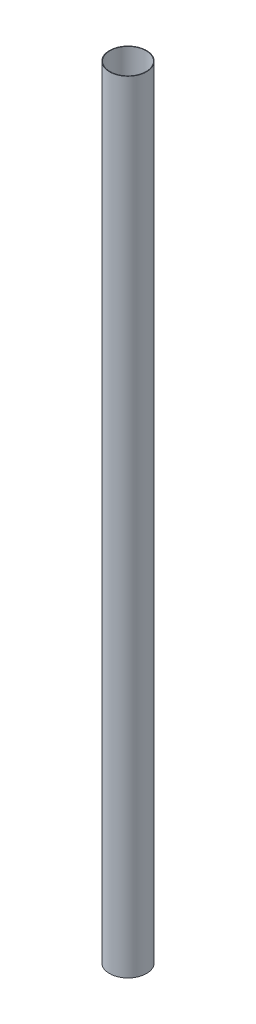
ISO-10303-21;
HEADER;
FILE_DESCRIPTION(('STEP AP214'),'2;1');
FILE_NAME('part.step','',(''),(''),'','','');
FILE_SCHEMA(('AUTOMOTIVE_DESIGN { 1 0 10303 214 1 1 1 1 }'));
ENDSEC;
DATA;
#1=APPLICATION_CONTEXT('core data for automotive mechanical design processes');
#2=APPLICATION_PROTOCOL_DEFINITION('international standard','automotive_design',2000,#1);
#3=PRODUCT_CONTEXT('',#1,'mechanical');
#4=PRODUCT('Part','Part','',(#3));
#5=PRODUCT_RELATED_PRODUCT_CATEGORY('part','',(#4));
#6=PRODUCT_DEFINITION_FORMATION('','',#4);
#7=PRODUCT_DEFINITION_CONTEXT('part definition',#1,'design');
#8=PRODUCT_DEFINITION('design','',#6,#7);
#9=PRODUCT_DEFINITION_SHAPE('','',#8);
#10=(LENGTH_UNIT() NAMED_UNIT(*) SI_UNIT(.MILLI.,.METRE.));
#11=(NAMED_UNIT(*) PLANE_ANGLE_UNIT() SI_UNIT($,.RADIAN.));
#12=(NAMED_UNIT(*) SI_UNIT($,.STERADIAN.) SOLID_ANGLE_UNIT());
#13=UNCERTAINTY_MEASURE_WITH_UNIT(LENGTH_MEASURE(1.E-05),#10,'distance_accuracy_value','');
#14=(GEOMETRIC_REPRESENTATION_CONTEXT(3) GLOBAL_UNCERTAINTY_ASSIGNED_CONTEXT((#13)) GLOBAL_UNIT_ASSIGNED_CONTEXT((#10,
#11,#12)) REPRESENTATION_CONTEXT('',''));
#15=CARTESIAN_POINT('',(0.,0.,0.));
#16=DIRECTION('',(0.,0.,1.));
#17=DIRECTION('',(1.,0.,0.));
#18=AXIS2_PLACEMENT_3D('',#15,#16,#17);
#19=CARTESIAN_POINT('',(0.,0.,0.));
#20=DIRECTION('',(0.,1.,0.));
#21=DIRECTION('',(0.,0.,1.));
#22=AXIS2_PLACEMENT_3D('',#19,#20,#21);
#23=CYLINDRICAL_SURFACE('',#22,76.);
#24=CARTESIAN_POINT('',(0.,3200.,0.));
#25=DIRECTION('',(0.,1.,0.));
#26=DIRECTION('',(0.,0.,1.));
#27=AXIS2_PLACEMENT_3D('',#24,#25,#26);
#28=CIRCLE('',#27,76.);
#29=CARTESIAN_POINT('',(0.,3200.,76.));
#30=VERTEX_POINT('',#29);
#31=EDGE_CURVE('E53',#30,#30,#28,.T.);
#32=ORIENTED_EDGE('',*,*,#31,.F.);
#33=EDGE_LOOP('',(#32));
#34=FACE_BOUND('',#33,.T.);
#35=CARTESIAN_POINT('',(0.,0.,0.));
#36=DIRECTION('',(0.,1.,0.));
#37=DIRECTION('',(0.,0.,1.));
#38=AXIS2_PLACEMENT_3D('',#35,#36,#37);
#39=CIRCLE('',#38,76.);
#40=CARTESIAN_POINT('',(0.,0.,76.));
#41=VERTEX_POINT('',#40);
#42=EDGE_CURVE('E38',#41,#41,#39,.T.);
#43=ORIENTED_EDGE('',*,*,#42,.T.);
#44=EDGE_LOOP('',(#43));
#45=FACE_BOUND('',#44,.T.);
#46=ADVANCED_FACE('F35',(#34,#45),#23,.T.);
#47=CARTESIAN_POINT('',(0.,0.,0.));
#48=DIRECTION('',(0.,1.,0.));
#49=DIRECTION('',(0.,0.,1.));
#50=AXIS2_PLACEMENT_3D('',#47,#48,#49);
#51=PLANE('',#50);
#52=CARTESIAN_POINT('',(0.,0.,0.));
#53=DIRECTION('',(0.,1.,0.));
#54=DIRECTION('',(0.,0.,1.));
#55=AXIS2_PLACEMENT_3D('',#52,#53,#54);
#56=CIRCLE('',#55,74.);
#57=CARTESIAN_POINT('',(0.,0.,74.));
#58=VERTEX_POINT('',#57);
#59=EDGE_CURVE('E43',#58,#58,#56,.F.);
#60=ORIENTED_EDGE('',*,*,#59,.F.);
#61=EDGE_LOOP('',(#60));
#62=FACE_BOUND('',#61,.T.);
#63=ORIENTED_EDGE('',*,*,#42,.F.);
#64=EDGE_LOOP('',(#63));
#65=FACE_BOUND('',#64,.T.);
#66=ADVANCED_FACE('F71',(#62,#65),#51,.F.);
#67=CARTESIAN_POINT('',(0.,3200.,0.));
#68=DIRECTION('',(0.,1.,0.));
#69=DIRECTION('',(0.,0.,1.));
#70=AXIS2_PLACEMENT_3D('',#67,#68,#69);
#71=PLANE('',#70);
#72=CARTESIAN_POINT('',(0.,3200.,0.));
#73=DIRECTION('',(0.,1.,0.));
#74=DIRECTION('',(0.,0.,1.));
#75=AXIS2_PLACEMENT_3D('',#72,#73,#74);
#76=CIRCLE('',#75,74.);
#77=CARTESIAN_POINT('',(0.,3200.,74.));
#78=VERTEX_POINT('',#77);
#79=EDGE_CURVE('E11',#78,#78,#76,.F.);
#80=ORIENTED_EDGE('',*,*,#79,.T.);
#81=EDGE_LOOP('',(#80));
#82=FACE_BOUND('',#81,.T.);
#83=ORIENTED_EDGE('',*,*,#31,.T.);
#84=EDGE_LOOP('',(#83));
#85=FACE_BOUND('',#84,.T.);
#86=ADVANCED_FACE('F60',(#82,#85),#71,.T.);
#87=CARTESIAN_POINT('',(0.,0.,0.));
#88=DIRECTION('',(0.,1.,0.));
#89=DIRECTION('',(0.,0.,1.));
#90=AXIS2_PLACEMENT_3D('',#87,#88,#89);
#91=CYLINDRICAL_SURFACE('',#90,74.);
#92=ORIENTED_EDGE('',*,*,#79,.F.);
#93=EDGE_LOOP('',(#92));
#94=FACE_BOUND('',#93,.T.);
#95=ORIENTED_EDGE('',*,*,#59,.T.);
#96=EDGE_LOOP('',(#95));
#97=FACE_BOUND('',#96,.T.);
#98=ADVANCED_FACE('F63',(#94,#97),#91,.F.);
#99=CLOSED_SHELL('',(#46,#66,#86,#98));
#100=MANIFOLD_SOLID_BREP('B2',#99);
#101=ADVANCED_BREP_SHAPE_REPRESENTATION('',(#18,#100),#14);
#102=SHAPE_DEFINITION_REPRESENTATION(#9,#101);
ENDSEC;
END-ISO-10303-21;
